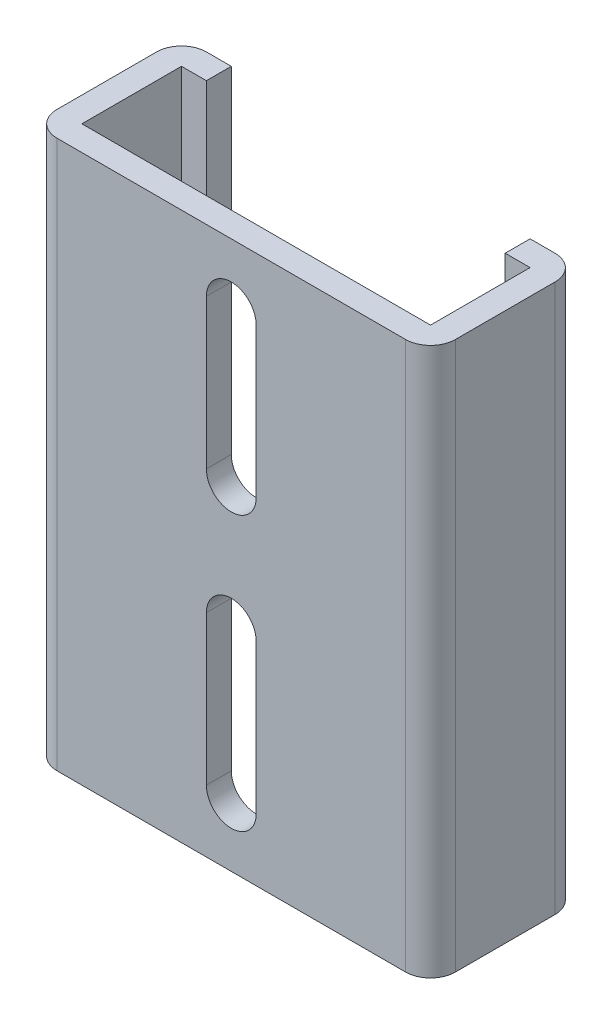
ISO-10303-21;
HEADER;
FILE_DESCRIPTION(('STEP AP214'),'2;1');
FILE_NAME('part.step','',(''),(''),'','','');
FILE_SCHEMA(('AUTOMOTIVE_DESIGN { 1 0 10303 214 1 1 1 1 }'));
ENDSEC;
DATA;
#1=APPLICATION_CONTEXT('core data for automotive mechanical design processes');
#2=APPLICATION_PROTOCOL_DEFINITION('international standard','automotive_design',2000,#1);
#3=PRODUCT_CONTEXT('',#1,'mechanical');
#4=PRODUCT('Part','Part','',(#3));
#5=PRODUCT_RELATED_PRODUCT_CATEGORY('part','',(#4));
#6=PRODUCT_DEFINITION_FORMATION('','',#4);
#7=PRODUCT_DEFINITION_CONTEXT('part definition',#1,'design');
#8=PRODUCT_DEFINITION('design','',#6,#7);
#9=PRODUCT_DEFINITION_SHAPE('','',#8);
#10=(LENGTH_UNIT() NAMED_UNIT(*) SI_UNIT(.MILLI.,.METRE.));
#11=(NAMED_UNIT(*) PLANE_ANGLE_UNIT() SI_UNIT($,.RADIAN.));
#12=(NAMED_UNIT(*) SI_UNIT($,.STERADIAN.) SOLID_ANGLE_UNIT());
#13=UNCERTAINTY_MEASURE_WITH_UNIT(LENGTH_MEASURE(1.E-05),#10,'distance_accuracy_value','');
#14=(GEOMETRIC_REPRESENTATION_CONTEXT(3) GLOBAL_UNCERTAINTY_ASSIGNED_CONTEXT((#13)) GLOBAL_UNIT_ASSIGNED_CONTEXT((#10,
#11,#12)) REPRESENTATION_CONTEXT('',''));
#15=CARTESIAN_POINT('',(0.,0.,0.));
#16=DIRECTION('',(0.,0.,1.));
#17=DIRECTION('',(1.,0.,0.));
#18=AXIS2_PLACEMENT_3D('',#15,#16,#17);
#19=CARTESIAN_POINT('',(-3.5,11.,-2.5));
#20=DIRECTION('',(0.,0.,-1.));
#21=DIRECTION('',(-1.,0.,0.));
#22=AXIS2_PLACEMENT_3D('',#19,#20,#21);
#23=PLANE('',#22);
#24=DIRECTION('',(1.,0.,0.));
#25=VECTOR('',#24,1.);
#26=CARTESIAN_POINT('',(-3.5,0.,-2.5));
#27=LINE('',#26,#25);
#28=CARTESIAN_POINT('',(-3.5,0.,-2.5));
#29=VERTEX_POINT('',#28);
#30=CARTESIAN_POINT('',(-3.,0.,-2.5));
#31=VERTEX_POINT('',#30);
#32=EDGE_CURVE('E257',#29,#31,#27,.T.);
#33=ORIENTED_EDGE('',*,*,#32,.T.);
#34=DIRECTION('',(0.,-1.,0.));
#35=VECTOR('',#34,1.);
#36=CARTESIAN_POINT('',(-3.,11.,-2.5));
#37=LINE('',#36,#35);
#38=CARTESIAN_POINT('',(-3.,11.,-2.5));
#39=VERTEX_POINT('',#38);
#40=EDGE_CURVE('E403',#39,#31,#37,.T.);
#41=ORIENTED_EDGE('',*,*,#40,.F.);
#42=DIRECTION('',(1.,0.,0.));
#43=VECTOR('',#42,1.);
#44=CARTESIAN_POINT('',(-3.5,11.,-2.5));
#45=LINE('',#44,#43);
#46=CARTESIAN_POINT('',(-3.5,11.,-2.5));
#47=VERTEX_POINT('',#46);
#48=EDGE_CURVE('E266',#47,#39,#45,.T.);
#49=ORIENTED_EDGE('',*,*,#48,.F.);
#50=DIRECTION('',(0.,-1.,0.));
#51=VECTOR('',#50,1.);
#52=CARTESIAN_POINT('',(-3.5,11.,-2.5));
#53=LINE('',#52,#51);
#54=EDGE_CURVE('E319',#47,#29,#53,.T.);
#55=ORIENTED_EDGE('',*,*,#54,.T.);
#56=EDGE_LOOP('',(#33,#41,#49,#55));
#57=FACE_BOUND('',#56,.T.);
#58=ADVANCED_FACE('F41',(#57),#23,.F.);
#59=CARTESIAN_POINT('',(-3.,11.,-3.));
#60=DIRECTION('',(1.,0.,0.));
#61=DIRECTION('',(0.,0.,-1.));
#62=AXIS2_PLACEMENT_3D('',#59,#60,#61);
#63=PLANE('',#62);
#64=DIRECTION('',(0.,0.,1.));
#65=VECTOR('',#64,1.);
#66=CARTESIAN_POINT('',(-3.,0.,-3.));
#67=LINE('',#66,#65);
#68=CARTESIAN_POINT('',(-3.,0.,-3.));
#69=VERTEX_POINT('',#68);
#70=EDGE_CURVE('E322',#69,#31,#67,.T.);
#71=ORIENTED_EDGE('',*,*,#70,.F.);
#72=DIRECTION('',(0.,-1.,0.));
#73=VECTOR('',#72,1.);
#74=CARTESIAN_POINT('',(-3.,11.,-3.));
#75=LINE('',#74,#73);
#76=CARTESIAN_POINT('',(-3.,11.,-3.));
#77=VERTEX_POINT('',#76);
#78=EDGE_CURVE('E401',#77,#69,#75,.T.);
#79=ORIENTED_EDGE('',*,*,#78,.F.);
#80=DIRECTION('',(0.,0.,1.));
#81=VECTOR('',#80,1.);
#82=CARTESIAN_POINT('',(-3.,11.,-3.));
#83=LINE('',#82,#81);
#84=EDGE_CURVE('E268',#77,#39,#83,.T.);
#85=ORIENTED_EDGE('',*,*,#84,.T.);
#86=ORIENTED_EDGE('',*,*,#40,.T.);
#87=EDGE_LOOP('',(#71,#79,#85,#86));
#88=FACE_BOUND('',#87,.T.);
#89=ADVANCED_FACE('F444',(#88),#63,.T.);
#90=CARTESIAN_POINT('',(-3.5,11.,-3.));
#91=DIRECTION('',(0.,0.,-1.));
#92=DIRECTION('',(-1.,0.,0.));
#93=AXIS2_PLACEMENT_3D('',#90,#91,#92);
#94=PLANE('',#93);
#95=DIRECTION('',(1.,0.,0.));
#96=VECTOR('',#95,1.);
#97=CARTESIAN_POINT('',(-3.5,0.,-3.));
#98=LINE('',#97,#96);
#99=CARTESIAN_POINT('',(-3.5,0.,-3.));
#100=VERTEX_POINT('',#99);
#101=EDGE_CURVE('E325',#100,#69,#98,.T.);
#102=ORIENTED_EDGE('',*,*,#101,.F.);
#103=DIRECTION('',(0.,-1.,0.));
#104=VECTOR('',#103,1.);
#105=CARTESIAN_POINT('',(-3.5,11.,-3.));
#106=LINE('',#105,#104);
#107=CARTESIAN_POINT('',(-3.5,11.,-3.));
#108=VERTEX_POINT('',#107);
#109=EDGE_CURVE('E399',#108,#100,#106,.T.);
#110=ORIENTED_EDGE('',*,*,#109,.F.);
#111=DIRECTION('',(1.,0.,0.));
#112=VECTOR('',#111,1.);
#113=CARTESIAN_POINT('',(-3.5,11.,-3.));
#114=LINE('',#113,#112);
#115=EDGE_CURVE('E272',#108,#77,#114,.T.);
#116=ORIENTED_EDGE('',*,*,#115,.T.);
#117=ORIENTED_EDGE('',*,*,#78,.T.);
#118=EDGE_LOOP('',(#102,#110,#116,#117));
#119=FACE_BOUND('',#118,.T.);
#120=ADVANCED_FACE('F449',(#119),#94,.T.);
#121=CARTESIAN_POINT('',(-3.5,11.,-2.5));
#122=DIRECTION('',(0.,-1.,0.));
#123=DIRECTION('',(0.,0.,-1.));
#124=AXIS2_PLACEMENT_3D('',#121,#122,#123);
#125=CYLINDRICAL_SURFACE('',#124,0.5);
#126=CARTESIAN_POINT('',(-3.5,0.,-2.5));
#127=DIRECTION('',(0.,-1.,0.));
#128=DIRECTION('',(0.,0.,-1.));
#129=AXIS2_PLACEMENT_3D('',#126,#127,#128);
#130=CIRCLE('',#129,0.5);
#131=CARTESIAN_POINT('',(-4.,0.,-2.5));
#132=VERTEX_POINT('',#131);
#133=EDGE_CURVE('E328',#132,#100,#130,.T.);
#134=ORIENTED_EDGE('',*,*,#133,.F.);
#135=DIRECTION('',(0.,-1.,0.));
#136=VECTOR('',#135,1.);
#137=CARTESIAN_POINT('',(-4.,11.,-2.5));
#138=LINE('',#137,#136);
#139=CARTESIAN_POINT('',(-4.,11.,-2.5));
#140=VERTEX_POINT('',#139);
#141=EDGE_CURVE('E397',#140,#132,#138,.T.);
#142=ORIENTED_EDGE('',*,*,#141,.F.);
#143=CARTESIAN_POINT('',(-3.5,11.,-2.5));
#144=DIRECTION('',(0.,-1.,0.));
#145=DIRECTION('',(0.,0.,-1.));
#146=AXIS2_PLACEMENT_3D('',#143,#144,#145);
#147=CIRCLE('',#146,0.5);
#148=EDGE_CURVE('E275',#140,#108,#147,.T.);
#149=ORIENTED_EDGE('',*,*,#148,.T.);
#150=ORIENTED_EDGE('',*,*,#109,.T.);
#151=EDGE_LOOP('',(#134,#142,#149,#150));
#152=FACE_BOUND('',#151,.T.);
#153=ADVANCED_FACE('F468',(#152),#125,.T.);
#154=CARTESIAN_POINT('',(-4.,11.,-0.5));
#155=DIRECTION('',(-1.,0.,0.));
#156=DIRECTION('',(0.,0.,1.));
#157=AXIS2_PLACEMENT_3D('',#154,#155,#156);
#158=PLANE('',#157);
#159=DIRECTION('',(0.,0.,-1.));
#160=VECTOR('',#159,1.);
#161=CARTESIAN_POINT('',(-4.,0.,-0.5));
#162=LINE('',#161,#160);
#163=CARTESIAN_POINT('',(-4.,0.,-0.5));
#164=VERTEX_POINT('',#163);
#165=EDGE_CURVE('E331',#164,#132,#162,.T.);
#166=ORIENTED_EDGE('',*,*,#165,.F.);
#167=DIRECTION('',(0.,-1.,0.));
#168=VECTOR('',#167,1.);
#169=CARTESIAN_POINT('',(-4.,11.,-0.5));
#170=LINE('',#169,#168);
#171=CARTESIAN_POINT('',(-4.,11.,-0.5));
#172=VERTEX_POINT('',#171);
#173=EDGE_CURVE('E395',#172,#164,#170,.T.);
#174=ORIENTED_EDGE('',*,*,#173,.F.);
#175=DIRECTION('',(0.,0.,-1.));
#176=VECTOR('',#175,1.);
#177=CARTESIAN_POINT('',(-4.,11.,-0.5));
#178=LINE('',#177,#176);
#179=EDGE_CURVE('E278',#172,#140,#178,.T.);
#180=ORIENTED_EDGE('',*,*,#179,.T.);
#181=ORIENTED_EDGE('',*,*,#141,.T.);
#182=EDGE_LOOP('',(#166,#174,#180,#181));
#183=FACE_BOUND('',#182,.T.);
#184=ADVANCED_FACE('F473',(#183),#158,.T.);
#185=CARTESIAN_POINT('',(-3.5,11.,-0.5));
#186=DIRECTION('',(0.,-1.,0.));
#187=DIRECTION('',(0.,0.,-1.));
#188=AXIS2_PLACEMENT_3D('',#185,#186,#187);
#189=CYLINDRICAL_SURFACE('',#188,0.5);
#190=CARTESIAN_POINT('',(-3.5,0.,-0.5));
#191=DIRECTION('',(0.,-1.,0.));
#192=DIRECTION('',(0.,0.,-1.));
#193=AXIS2_PLACEMENT_3D('',#190,#191,#192);
#194=CIRCLE('',#193,0.5);
#195=CARTESIAN_POINT('',(-3.5,0.,0.));
#196=VERTEX_POINT('',#195);
#197=EDGE_CURVE('E334',#196,#164,#194,.T.);
#198=ORIENTED_EDGE('',*,*,#197,.F.);
#199=DIRECTION('',(0.,-1.,0.));
#200=VECTOR('',#199,1.);
#201=CARTESIAN_POINT('',(-3.5,11.,0.));
#202=LINE('',#201,#200);
#203=CARTESIAN_POINT('',(-3.5,11.,0.));
#204=VERTEX_POINT('',#203);
#205=EDGE_CURVE('E393',#204,#196,#202,.T.);
#206=ORIENTED_EDGE('',*,*,#205,.F.);
#207=CARTESIAN_POINT('',(-3.5,11.,-0.5));
#208=DIRECTION('',(0.,-1.,0.));
#209=DIRECTION('',(0.,0.,-1.));
#210=AXIS2_PLACEMENT_3D('',#207,#208,#209);
#211=CIRCLE('',#210,0.5);
#212=EDGE_CURVE('E281',#204,#172,#211,.T.);
#213=ORIENTED_EDGE('',*,*,#212,.T.);
#214=ORIENTED_EDGE('',*,*,#173,.T.);
#215=EDGE_LOOP('',(#198,#206,#213,#214));
#216=FACE_BOUND('',#215,.T.);
#217=ADVANCED_FACE('F476',(#216),#189,.T.);
#218=CARTESIAN_POINT('',(-3.5,11.,0.));
#219=DIRECTION('',(0.,0.,1.));
#220=DIRECTION('',(1.,0.,0.));
#221=AXIS2_PLACEMENT_3D('',#218,#219,#220);
#222=PLANE('',#221);
#223=CARTESIAN_POINT('',(0.,4.25,0.));
#224=DIRECTION('',(0.,0.,1.));
#225=DIRECTION('',(1.,0.,0.));
#226=AXIS2_PLACEMENT_3D('',#223,#224,#225);
#227=CIRCLE('',#226,0.5);
#228=CARTESIAN_POINT('',(0.499999999999999,4.25,0.));
#229=VERTEX_POINT('',#228);
#230=CARTESIAN_POINT('',(-0.5,4.25,0.));
#231=VERTEX_POINT('',#230);
#232=EDGE_CURVE('E55',#229,#231,#227,.T.);
#233=ORIENTED_EDGE('',*,*,#232,.F.);
#234=DIRECTION('',(0.,1.,0.));
#235=VECTOR('',#234,1.);
#236=CARTESIAN_POINT('',(0.499999999999999,4.25,0.));
#237=LINE('',#236,#235);
#238=CARTESIAN_POINT('',(0.5,1.25,0.));
#239=VERTEX_POINT('',#238);
#240=EDGE_CURVE('E231',#239,#229,#237,.T.);
#241=ORIENTED_EDGE('',*,*,#240,.F.);
#242=CARTESIAN_POINT('',(0.,1.25,0.));
#243=DIRECTION('',(0.,0.,1.));
#244=DIRECTION('',(1.,0.,0.));
#245=AXIS2_PLACEMENT_3D('',#242,#243,#244);
#246=CIRCLE('',#245,0.5);
#247=CARTESIAN_POINT('',(-0.499999999999999,1.25,0.));
#248=VERTEX_POINT('',#247);
#249=EDGE_CURVE('E215',#248,#239,#246,.T.);
#250=ORIENTED_EDGE('',*,*,#249,.F.);
#251=DIRECTION('',(0.,-1.,0.));
#252=VECTOR('',#251,1.);
#253=CARTESIAN_POINT('',(-0.5,4.25,0.));
#254=LINE('',#253,#252);
#255=EDGE_CURVE('E224',#231,#248,#254,.T.);
#256=ORIENTED_EDGE('',*,*,#255,.F.);
#257=EDGE_LOOP('',(#233,#241,#250,#256));
#258=FACE_BOUND('',#257,.T.);
#259=CARTESIAN_POINT('',(0.,6.75,0.));
#260=DIRECTION('',(0.,0.,1.));
#261=DIRECTION('',(1.,0.,0.));
#262=AXIS2_PLACEMENT_3D('',#259,#260,#261);
#263=CIRCLE('',#262,0.5);
#264=CARTESIAN_POINT('',(-0.5,6.75,0.));
#265=VERTEX_POINT('',#264);
#266=CARTESIAN_POINT('',(0.499999999999999,6.75,0.));
#267=VERTEX_POINT('',#266);
#268=EDGE_CURVE('E238',#265,#267,#263,.T.);
#269=ORIENTED_EDGE('',*,*,#268,.F.);
#270=DIRECTION('',(0.,-1.,0.));
#271=VECTOR('',#270,1.);
#272=CARTESIAN_POINT('',(-0.5,6.75,0.));
#273=LINE('',#272,#271);
#274=CARTESIAN_POINT('',(-0.5,9.75,0.));
#275=VERTEX_POINT('',#274);
#276=EDGE_CURVE('E250',#275,#265,#273,.T.);
#277=ORIENTED_EDGE('',*,*,#276,.F.);
#278=CARTESIAN_POINT('',(0.,9.75,0.));
#279=DIRECTION('',(0.,0.,1.));
#280=DIRECTION('',(1.,0.,0.));
#281=AXIS2_PLACEMENT_3D('',#278,#279,#280);
#282=CIRCLE('',#281,0.5);
#283=CARTESIAN_POINT('',(0.499999999999999,9.75,0.));
#284=VERTEX_POINT('',#283);
#285=EDGE_CURVE('E246',#284,#275,#282,.T.);
#286=ORIENTED_EDGE('',*,*,#285,.F.);
#287=DIRECTION('',(0.,1.,0.));
#288=VECTOR('',#287,1.);
#289=CARTESIAN_POINT('',(0.5,6.75,0.));
#290=LINE('',#289,#288);
#291=EDGE_CURVE('E242',#267,#284,#290,.T.);
#292=ORIENTED_EDGE('',*,*,#291,.F.);
#293=EDGE_LOOP('',(#269,#277,#286,#292));
#294=FACE_BOUND('',#293,.T.);
#295=DIRECTION('',(-1.,0.,0.));
#296=VECTOR('',#295,1.);
#297=CARTESIAN_POINT('',(-3.5,0.,0.));
#298=LINE('',#297,#296);
#299=CARTESIAN_POINT('',(3.5,0.,0.));
#300=VERTEX_POINT('',#299);
#301=EDGE_CURVE('E337',#300,#196,#298,.T.);
#302=ORIENTED_EDGE('',*,*,#301,.F.);
#303=DIRECTION('',(0.,-1.,0.));
#304=VECTOR('',#303,1.);
#305=CARTESIAN_POINT('',(3.5,11.,0.));
#306=LINE('',#305,#304);
#307=CARTESIAN_POINT('',(3.5,11.,0.));
#308=VERTEX_POINT('',#307);
#309=EDGE_CURVE('E390',#308,#300,#306,.T.);
#310=ORIENTED_EDGE('',*,*,#309,.F.);
#311=DIRECTION('',(-1.,0.,0.));
#312=VECTOR('',#311,1.);
#313=CARTESIAN_POINT('',(-3.5,11.,0.));
#314=LINE('',#313,#312);
#315=EDGE_CURVE('E284',#308,#204,#314,.T.);
#316=ORIENTED_EDGE('',*,*,#315,.T.);
#317=ORIENTED_EDGE('',*,*,#205,.T.);
#318=EDGE_LOOP('',(#302,#310,#316,#317));
#319=FACE_BOUND('',#318,.T.);
#320=ADVANCED_FACE('F228',(#258,#294,#319),#222,.T.);
#321=CARTESIAN_POINT('',(3.5,11.,-0.5));
#322=DIRECTION('',(0.,-1.,0.));
#323=DIRECTION('',(0.,0.,-1.));
#324=AXIS2_PLACEMENT_3D('',#321,#322,#323);
#325=CYLINDRICAL_SURFACE('',#324,0.5);
#326=CARTESIAN_POINT('',(3.5,0.,-0.5));
#327=DIRECTION('',(0.,-1.,0.));
#328=DIRECTION('',(0.,0.,1.));
#329=AXIS2_PLACEMENT_3D('',#326,#327,#328);
#330=CIRCLE('',#329,0.5);
#331=CARTESIAN_POINT('',(4.,0.,-0.5));
#332=VERTEX_POINT('',#331);
#333=EDGE_CURVE('E340',#332,#300,#330,.T.);
#334=ORIENTED_EDGE('',*,*,#333,.F.);
#335=DIRECTION('',(0.,-1.,0.));
#336=VECTOR('',#335,1.);
#337=CARTESIAN_POINT('',(4.,11.,-0.5));
#338=LINE('',#337,#336);
#339=CARTESIAN_POINT('',(4.,11.,-0.5));
#340=VERTEX_POINT('',#339);
#341=EDGE_CURVE('E387',#340,#332,#338,.T.);
#342=ORIENTED_EDGE('',*,*,#341,.F.);
#343=CARTESIAN_POINT('',(3.5,11.,-0.5));
#344=DIRECTION('',(0.,-1.,0.));
#345=DIRECTION('',(0.,0.,1.));
#346=AXIS2_PLACEMENT_3D('',#343,#344,#345);
#347=CIRCLE('',#346,0.5);
#348=EDGE_CURVE('E288',#340,#308,#347,.T.);
#349=ORIENTED_EDGE('',*,*,#348,.T.);
#350=ORIENTED_EDGE('',*,*,#309,.T.);
#351=EDGE_LOOP('',(#334,#342,#349,#350));
#352=FACE_BOUND('',#351,.T.);
#353=ADVANCED_FACE('F483',(#352),#325,.T.);
#354=CARTESIAN_POINT('',(4.,11.,-0.5));
#355=DIRECTION('',(1.,0.,0.));
#356=DIRECTION('',(0.,0.,-1.));
#357=AXIS2_PLACEMENT_3D('',#354,#355,#356);
#358=PLANE('',#357);
#359=DIRECTION('',(0.,0.,1.));
#360=VECTOR('',#359,1.);
#361=CARTESIAN_POINT('',(4.,0.,-0.5));
#362=LINE('',#361,#360);
#363=CARTESIAN_POINT('',(4.,0.,-2.5));
#364=VERTEX_POINT('',#363);
#365=EDGE_CURVE('E343',#364,#332,#362,.T.);
#366=ORIENTED_EDGE('',*,*,#365,.F.);
#367=DIRECTION('',(0.,-1.,0.));
#368=VECTOR('',#367,1.);
#369=CARTESIAN_POINT('',(4.,11.,-2.5));
#370=LINE('',#369,#368);
#371=CARTESIAN_POINT('',(4.,11.,-2.5));
#372=VERTEX_POINT('',#371);
#373=EDGE_CURVE('E384',#372,#364,#370,.T.);
#374=ORIENTED_EDGE('',*,*,#373,.F.);
#375=DIRECTION('',(0.,0.,1.));
#376=VECTOR('',#375,1.);
#377=CARTESIAN_POINT('',(4.,11.,-0.5));
#378=LINE('',#377,#376);
#379=EDGE_CURVE('E292',#372,#340,#378,.T.);
#380=ORIENTED_EDGE('',*,*,#379,.T.);
#381=ORIENTED_EDGE('',*,*,#341,.T.);
#382=EDGE_LOOP('',(#366,#374,#380,#381));
#383=FACE_BOUND('',#382,.T.);
#384=ADVANCED_FACE('F488',(#383),#358,.T.);
#385=CARTESIAN_POINT('',(3.5,11.,-2.5));
#386=DIRECTION('',(0.,-1.,0.));
#387=DIRECTION('',(0.,0.,-1.));
#388=AXIS2_PLACEMENT_3D('',#385,#386,#387);
#389=CYLINDRICAL_SURFACE('',#388,0.5);
#390=CARTESIAN_POINT('',(3.5,0.,-2.5));
#391=DIRECTION('',(0.,-1.,0.));
#392=DIRECTION('',(0.,0.,1.));
#393=AXIS2_PLACEMENT_3D('',#390,#391,#392);
#394=CIRCLE('',#393,0.5);
#395=CARTESIAN_POINT('',(3.5,0.,-3.));
#396=VERTEX_POINT('',#395);
#397=EDGE_CURVE('E346',#396,#364,#394,.T.);
#398=ORIENTED_EDGE('',*,*,#397,.F.);
#399=DIRECTION('',(0.,-1.,0.));
#400=VECTOR('',#399,1.);
#401=CARTESIAN_POINT('',(3.5,11.,-3.));
#402=LINE('',#401,#400);
#403=CARTESIAN_POINT('',(3.5,11.,-3.));
#404=VERTEX_POINT('',#403);
#405=EDGE_CURVE('E381',#404,#396,#402,.T.);
#406=ORIENTED_EDGE('',*,*,#405,.F.);
#407=CARTESIAN_POINT('',(3.5,11.,-2.5));
#408=DIRECTION('',(0.,-1.,0.));
#409=DIRECTION('',(0.,0.,1.));
#410=AXIS2_PLACEMENT_3D('',#407,#408,#409);
#411=CIRCLE('',#410,0.5);
#412=EDGE_CURVE('E296',#404,#372,#411,.T.);
#413=ORIENTED_EDGE('',*,*,#412,.T.);
#414=ORIENTED_EDGE('',*,*,#373,.T.);
#415=EDGE_LOOP('',(#398,#406,#413,#414));
#416=FACE_BOUND('',#415,.T.);
#417=ADVANCED_FACE('F491',(#416),#389,.T.);
#418=CARTESIAN_POINT('',(3.5,11.,-3.));
#419=DIRECTION('',(0.,0.,-1.));
#420=DIRECTION('',(-1.,0.,0.));
#421=AXIS2_PLACEMENT_3D('',#418,#419,#420);
#422=PLANE('',#421);
#423=DIRECTION('',(1.,0.,0.));
#424=VECTOR('',#423,1.);
#425=CARTESIAN_POINT('',(3.5,0.,-3.));
#426=LINE('',#425,#424);
#427=CARTESIAN_POINT('',(3.,0.,-3.));
#428=VERTEX_POINT('',#427);
#429=EDGE_CURVE('E349',#428,#396,#426,.T.);
#430=ORIENTED_EDGE('',*,*,#429,.F.);
#431=DIRECTION('',(0.,-1.,0.));
#432=VECTOR('',#431,1.);
#433=CARTESIAN_POINT('',(3.,11.,-3.));
#434=LINE('',#433,#432);
#435=CARTESIAN_POINT('',(3.,11.,-3.));
#436=VERTEX_POINT('',#435);
#437=EDGE_CURVE('E378',#436,#428,#434,.T.);
#438=ORIENTED_EDGE('',*,*,#437,.F.);
#439=DIRECTION('',(1.,0.,0.));
#440=VECTOR('',#439,1.);
#441=CARTESIAN_POINT('',(3.5,11.,-3.));
#442=LINE('',#441,#440);
#443=EDGE_CURVE('E300',#436,#404,#442,.T.);
#444=ORIENTED_EDGE('',*,*,#443,.T.);
#445=ORIENTED_EDGE('',*,*,#405,.T.);
#446=EDGE_LOOP('',(#430,#438,#444,#445));
#447=FACE_BOUND('',#446,.T.);
#448=ADVANCED_FACE('F496',(#447),#422,.T.);
#449=CARTESIAN_POINT('',(3.,11.,-2.5));
#450=DIRECTION('',(-1.,0.,0.));
#451=DIRECTION('',(0.,0.,1.));
#452=AXIS2_PLACEMENT_3D('',#449,#450,#451);
#453=PLANE('',#452);
#454=DIRECTION('',(0.,0.,-1.));
#455=VECTOR('',#454,1.);
#456=CARTESIAN_POINT('',(3.,0.,-2.5));
#457=LINE('',#456,#455);
#458=CARTESIAN_POINT('',(3.,0.,-2.5));
#459=VERTEX_POINT('',#458);
#460=EDGE_CURVE('E352',#459,#428,#457,.T.);
#461=ORIENTED_EDGE('',*,*,#460,.F.);
#462=DIRECTION('',(0.,-1.,0.));
#463=VECTOR('',#462,1.);
#464=CARTESIAN_POINT('',(3.,11.,-2.5));
#465=LINE('',#464,#463);
#466=CARTESIAN_POINT('',(3.,11.,-2.5));
#467=VERTEX_POINT('',#466);
#468=EDGE_CURVE('E375',#467,#459,#465,.T.);
#469=ORIENTED_EDGE('',*,*,#468,.F.);
#470=DIRECTION('',(0.,0.,-1.));
#471=VECTOR('',#470,1.);
#472=CARTESIAN_POINT('',(3.,11.,-2.5));
#473=LINE('',#472,#471);
#474=EDGE_CURVE('E304',#467,#436,#473,.T.);
#475=ORIENTED_EDGE('',*,*,#474,.T.);
#476=ORIENTED_EDGE('',*,*,#437,.T.);
#477=EDGE_LOOP('',(#461,#469,#475,#476));
#478=FACE_BOUND('',#477,.T.);
#479=ADVANCED_FACE('F499',(#478),#453,.T.);
#480=CARTESIAN_POINT('',(3.5,11.,-2.5));
#481=DIRECTION('',(0.,0.,-1.));
#482=DIRECTION('',(-1.,0.,0.));
#483=AXIS2_PLACEMENT_3D('',#480,#481,#482);
#484=PLANE('',#483);
#485=DIRECTION('',(1.,0.,0.));
#486=VECTOR('',#485,1.);
#487=CARTESIAN_POINT('',(3.5,0.,-2.5));
#488=LINE('',#487,#486);
#489=CARTESIAN_POINT('',(3.5,0.,-2.5));
#490=VERTEX_POINT('',#489);
#491=EDGE_CURVE('E355',#459,#490,#488,.T.);
#492=ORIENTED_EDGE('',*,*,#491,.T.);
#493=DIRECTION('',(0.,-1.,0.));
#494=VECTOR('',#493,1.);
#495=CARTESIAN_POINT('',(3.5,11.,-2.5));
#496=LINE('',#495,#494);
#497=CARTESIAN_POINT('',(3.5,11.,-2.5));
#498=VERTEX_POINT('',#497);
#499=EDGE_CURVE('E371',#498,#490,#496,.T.);
#500=ORIENTED_EDGE('',*,*,#499,.F.);
#501=DIRECTION('',(1.,0.,0.));
#502=VECTOR('',#501,1.);
#503=CARTESIAN_POINT('',(3.5,11.,-2.5));
#504=LINE('',#503,#502);
#505=EDGE_CURVE('E308',#467,#498,#504,.T.);
#506=ORIENTED_EDGE('',*,*,#505,.F.);
#507=ORIENTED_EDGE('',*,*,#468,.T.);
#508=EDGE_LOOP('',(#492,#500,#506,#507));
#509=FACE_BOUND('',#508,.T.);
#510=ADVANCED_FACE('F505',(#509),#484,.F.);
#511=CARTESIAN_POINT('',(3.5,11.,-0.5));
#512=DIRECTION('',(1.,0.,0.));
#513=DIRECTION('',(0.,0.,-1.));
#514=AXIS2_PLACEMENT_3D('',#511,#512,#513);
#515=PLANE('',#514);
#516=DIRECTION('',(0.,0.,-1.));
#517=VECTOR('',#516,1.);
#518=CARTESIAN_POINT('',(3.5,0.,-0.5));
#519=LINE('',#518,#517);
#520=CARTESIAN_POINT('',(3.5,0.,-0.5));
#521=VERTEX_POINT('',#520);
#522=EDGE_CURVE('E357',#490,#521,#519,.F.);
#523=ORIENTED_EDGE('',*,*,#522,.T.);
#524=DIRECTION('',(0.,-1.,0.));
#525=VECTOR('',#524,1.);
#526=CARTESIAN_POINT('',(3.5,11.,-0.5));
#527=LINE('',#526,#525);
#528=CARTESIAN_POINT('',(3.5,11.,-0.5));
#529=VERTEX_POINT('',#528);
#530=EDGE_CURVE('E367',#529,#521,#527,.T.);
#531=ORIENTED_EDGE('',*,*,#530,.F.);
#532=DIRECTION('',(0.,0.,-1.));
#533=VECTOR('',#532,1.);
#534=CARTESIAN_POINT('',(3.5,11.,-0.5));
#535=LINE('',#534,#533);
#536=EDGE_CURVE('E311',#498,#529,#535,.F.);
#537=ORIENTED_EDGE('',*,*,#536,.F.);
#538=ORIENTED_EDGE('',*,*,#499,.T.);
#539=EDGE_LOOP('',(#523,#531,#537,#538));
#540=FACE_BOUND('',#539,.T.);
#541=ADVANCED_FACE('F509',(#540),#515,.F.);
#542=CARTESIAN_POINT('',(-3.5,11.,-0.5));
#543=DIRECTION('',(0.,0.,1.));
#544=DIRECTION('',(1.,0.,0.));
#545=AXIS2_PLACEMENT_3D('',#542,#543,#544);
#546=PLANE('',#545);
#547=DIRECTION('',(0.,1.,0.));
#548=VECTOR('',#547,1.);
#549=CARTESIAN_POINT('',(0.499999999999997,11.,-0.5));
#550=LINE('',#549,#548);
#551=CARTESIAN_POINT('',(0.5,1.25,-0.5));
#552=VERTEX_POINT('',#551);
#553=CARTESIAN_POINT('',(0.499999999999999,4.25,-0.5));
#554=VERTEX_POINT('',#553);
#555=EDGE_CURVE('E48',#552,#554,#550,.T.);
#556=ORIENTED_EDGE('',*,*,#555,.T.);
#557=CARTESIAN_POINT('',(0.,4.25,-0.5));
#558=DIRECTION('',(0.,0.,1.));
#559=DIRECTION('',(1.,0.,0.));
#560=AXIS2_PLACEMENT_3D('',#557,#558,#559);
#561=CIRCLE('',#560,0.5);
#562=CARTESIAN_POINT('',(-0.5,4.25,-0.5));
#563=VERTEX_POINT('',#562);
#564=EDGE_CURVE('E11',#554,#563,#561,.T.);
#565=ORIENTED_EDGE('',*,*,#564,.T.);
#566=DIRECTION('',(0.,-1.,0.));
#567=VECTOR('',#566,1.);
#568=CARTESIAN_POINT('',(-0.500000000000002,11.,-0.5));
#569=LINE('',#568,#567);
#570=CARTESIAN_POINT('',(-0.499999999999999,1.25,-0.5));
#571=VERTEX_POINT('',#570);
#572=EDGE_CURVE('E420',#563,#571,#569,.T.);
#573=ORIENTED_EDGE('',*,*,#572,.T.);
#574=CARTESIAN_POINT('',(0.,1.25,-0.5));
#575=DIRECTION('',(0.,0.,1.));
#576=DIRECTION('',(1.,0.,0.));
#577=AXIS2_PLACEMENT_3D('',#574,#575,#576);
#578=CIRCLE('',#577,0.5);
#579=EDGE_CURVE('E218',#571,#552,#578,.T.);
#580=ORIENTED_EDGE('',*,*,#579,.T.);
#581=EDGE_LOOP('',(#556,#565,#573,#580));
#582=FACE_BOUND('',#581,.T.);
#583=DIRECTION('',(0.,-1.,0.));
#584=VECTOR('',#583,1.);
#585=CARTESIAN_POINT('',(-0.5,11.,-0.5));
#586=LINE('',#585,#584);
#587=CARTESIAN_POINT('',(-0.5,9.75,-0.5));
#588=VERTEX_POINT('',#587);
#589=CARTESIAN_POINT('',(-0.5,6.75,-0.5));
#590=VERTEX_POINT('',#589);
#591=EDGE_CURVE('E413',#588,#590,#586,.T.);
#592=ORIENTED_EDGE('',*,*,#591,.T.);
#593=CARTESIAN_POINT('',(0.,6.75,-0.5));
#594=DIRECTION('',(0.,0.,1.));
#595=DIRECTION('',(1.,0.,0.));
#596=AXIS2_PLACEMENT_3D('',#593,#594,#595);
#597=CIRCLE('',#596,0.5);
#598=CARTESIAN_POINT('',(0.5,6.75,-0.5));
#599=VERTEX_POINT('',#598);
#600=EDGE_CURVE('E417',#590,#599,#597,.T.);
#601=ORIENTED_EDGE('',*,*,#600,.T.);
#602=DIRECTION('',(0.,1.,0.));
#603=VECTOR('',#602,1.);
#604=CARTESIAN_POINT('',(0.499999999999999,11.,-0.5));
#605=LINE('',#604,#603);
#606=CARTESIAN_POINT('',(0.499999999999999,9.75,-0.5));
#607=VERTEX_POINT('',#606);
#608=EDGE_CURVE('E405',#599,#607,#605,.T.);
#609=ORIENTED_EDGE('',*,*,#608,.T.);
#610=CARTESIAN_POINT('',(0.,9.75,-0.5));
#611=DIRECTION('',(0.,0.,1.));
#612=DIRECTION('',(1.,0.,0.));
#613=AXIS2_PLACEMENT_3D('',#610,#611,#612);
#614=CIRCLE('',#613,0.5);
#615=EDGE_CURVE('E409',#607,#588,#614,.T.);
#616=ORIENTED_EDGE('',*,*,#615,.T.);
#617=EDGE_LOOP('',(#592,#601,#609,#616));
#618=FACE_BOUND('',#617,.T.);
#619=DIRECTION('',(1.,0.,0.));
#620=VECTOR('',#619,1.);
#621=CARTESIAN_POINT('',(-3.5,0.,-0.5));
#622=LINE('',#621,#620);
#623=CARTESIAN_POINT('',(-3.5,0.,-0.5));
#624=VERTEX_POINT('',#623);
#625=EDGE_CURVE('E359',#521,#624,#622,.F.);
#626=ORIENTED_EDGE('',*,*,#625,.T.);
#627=DIRECTION('',(0.,-1.,0.));
#628=VECTOR('',#627,1.);
#629=CARTESIAN_POINT('',(-3.5,11.,-0.5));
#630=LINE('',#629,#628);
#631=CARTESIAN_POINT('',(-3.5,11.,-0.5));
#632=VERTEX_POINT('',#631);
#633=EDGE_CURVE('E364',#632,#624,#630,.T.);
#634=ORIENTED_EDGE('',*,*,#633,.F.);
#635=DIRECTION('',(1.,0.,0.));
#636=VECTOR('',#635,1.);
#637=CARTESIAN_POINT('',(-3.5,11.,-0.5));
#638=LINE('',#637,#636);
#639=EDGE_CURVE('E314',#529,#632,#638,.F.);
#640=ORIENTED_EDGE('',*,*,#639,.F.);
#641=ORIENTED_EDGE('',*,*,#530,.T.);
#642=EDGE_LOOP('',(#626,#634,#640,#641));
#643=FACE_BOUND('',#642,.T.);
#644=ADVANCED_FACE('F424',(#582,#618,#643),#546,.F.);
#645=CARTESIAN_POINT('',(-3.5,11.,-0.5));
#646=DIRECTION('',(-1.,0.,0.));
#647=DIRECTION('',(0.,0.,1.));
#648=AXIS2_PLACEMENT_3D('',#645,#646,#647);
#649=PLANE('',#648);
#650=DIRECTION('',(0.,0.,-1.));
#651=VECTOR('',#650,1.);
#652=CARTESIAN_POINT('',(-3.5,0.,-0.5));
#653=LINE('',#652,#651);
#654=EDGE_CURVE('E269',#624,#29,#653,.T.);
#655=ORIENTED_EDGE('',*,*,#654,.T.);
#656=ORIENTED_EDGE('',*,*,#54,.F.);
#657=DIRECTION('',(0.,0.,-1.));
#658=VECTOR('',#657,1.);
#659=CARTESIAN_POINT('',(-3.5,11.,-0.5));
#660=LINE('',#659,#658);
#661=EDGE_CURVE('E317',#632,#47,#660,.T.);
#662=ORIENTED_EDGE('',*,*,#661,.F.);
#663=ORIENTED_EDGE('',*,*,#633,.T.);
#664=EDGE_LOOP('',(#655,#656,#662,#663));
#665=FACE_BOUND('',#664,.T.);
#666=ADVANCED_FACE('F516',(#665),#649,.F.);
#667=CARTESIAN_POINT('',(-3.5,11.,-2.5));
#668=DIRECTION('',(0.,-1.,0.));
#669=DIRECTION('',(-1.,0.,0.));
#670=AXIS2_PLACEMENT_3D('',#667,#668,#669);
#671=PLANE('',#670);
#672=ORIENTED_EDGE('',*,*,#48,.T.);
#673=ORIENTED_EDGE('',*,*,#84,.F.);
#674=ORIENTED_EDGE('',*,*,#115,.F.);
#675=ORIENTED_EDGE('',*,*,#148,.F.);
#676=ORIENTED_EDGE('',*,*,#179,.F.);
#677=ORIENTED_EDGE('',*,*,#212,.F.);
#678=ORIENTED_EDGE('',*,*,#315,.F.);
#679=ORIENTED_EDGE('',*,*,#348,.F.);
#680=ORIENTED_EDGE('',*,*,#379,.F.);
#681=ORIENTED_EDGE('',*,*,#412,.F.);
#682=ORIENTED_EDGE('',*,*,#443,.F.);
#683=ORIENTED_EDGE('',*,*,#474,.F.);
#684=ORIENTED_EDGE('',*,*,#505,.T.);
#685=ORIENTED_EDGE('',*,*,#536,.T.);
#686=ORIENTED_EDGE('',*,*,#639,.T.);
#687=ORIENTED_EDGE('',*,*,#661,.T.);
#688=EDGE_LOOP('',(#672,#673,#674,#675,#676,#677,#678,#679,#680,#681,#682,#683,#684,#685,#686,#687));
#689=FACE_BOUND('',#688,.T.);
#690=ADVANCED_FACE('F463',(#689),#671,.F.);
#691=CARTESIAN_POINT('',(-3.5,0.,-2.5));
#692=DIRECTION('',(0.,-1.,0.));
#693=DIRECTION('',(-1.,0.,0.));
#694=AXIS2_PLACEMENT_3D('',#691,#692,#693);
#695=PLANE('',#694);
#696=ORIENTED_EDGE('',*,*,#32,.F.);
#697=ORIENTED_EDGE('',*,*,#654,.F.);
#698=ORIENTED_EDGE('',*,*,#625,.F.);
#699=ORIENTED_EDGE('',*,*,#522,.F.);
#700=ORIENTED_EDGE('',*,*,#491,.F.);
#701=ORIENTED_EDGE('',*,*,#460,.T.);
#702=ORIENTED_EDGE('',*,*,#429,.T.);
#703=ORIENTED_EDGE('',*,*,#397,.T.);
#704=ORIENTED_EDGE('',*,*,#365,.T.);
#705=ORIENTED_EDGE('',*,*,#333,.T.);
#706=ORIENTED_EDGE('',*,*,#301,.T.);
#707=ORIENTED_EDGE('',*,*,#197,.T.);
#708=ORIENTED_EDGE('',*,*,#165,.T.);
#709=ORIENTED_EDGE('',*,*,#133,.T.);
#710=ORIENTED_EDGE('',*,*,#101,.T.);
#711=ORIENTED_EDGE('',*,*,#70,.T.);
#712=EDGE_LOOP('',(#696,#697,#698,#699,#700,#701,#702,#703,#704,#705,#706,#707,#708,#709,#710,#711));
#713=FACE_BOUND('',#712,.T.);
#714=ADVANCED_FACE('F458',(#713),#695,.T.);
#715=CARTESIAN_POINT('',(0.,6.75,-1.));
#716=DIRECTION('',(0.,0.,1.));
#717=DIRECTION('',(1.,0.,0.));
#718=AXIS2_PLACEMENT_3D('',#715,#716,#717);
#719=CYLINDRICAL_SURFACE('',#718,0.5);
#720=DIRECTION('',(0.,0.,1.));
#721=VECTOR('',#720,1.);
#722=CARTESIAN_POINT('',(-0.5,6.75,-1.));
#723=LINE('',#722,#721);
#724=EDGE_CURVE('E255',#590,#265,#723,.T.);
#725=ORIENTED_EDGE('',*,*,#724,.T.);
#726=ORIENTED_EDGE('',*,*,#268,.T.);
#727=DIRECTION('',(0.,0.,1.));
#728=VECTOR('',#727,1.);
#729=CARTESIAN_POINT('',(0.5,6.75,-1.));
#730=LINE('',#729,#728);
#731=EDGE_CURVE('E254',#599,#267,#730,.T.);
#732=ORIENTED_EDGE('',*,*,#731,.F.);
#733=ORIENTED_EDGE('',*,*,#600,.F.);
#734=EDGE_LOOP('',(#725,#726,#732,#733));
#735=FACE_BOUND('',#734,.T.);
#736=ADVANCED_FACE('F607',(#735),#719,.F.);
#737=CARTESIAN_POINT('',(-0.5,6.75,-1.));
#738=DIRECTION('',(-1.,0.,0.));
#739=DIRECTION('',(0.,-1.,0.));
#740=AXIS2_PLACEMENT_3D('',#737,#738,#739);
#741=PLANE('',#740);
#742=DIRECTION('',(0.,0.,1.));
#743=VECTOR('',#742,1.);
#744=CARTESIAN_POINT('',(-0.5,9.75,-1.));
#745=LINE('',#744,#743);
#746=EDGE_CURVE('E258',#588,#275,#745,.T.);
#747=ORIENTED_EDGE('',*,*,#746,.T.);
#748=ORIENTED_EDGE('',*,*,#276,.T.);
#749=ORIENTED_EDGE('',*,*,#724,.F.);
#750=ORIENTED_EDGE('',*,*,#591,.F.);
#751=EDGE_LOOP('',(#747,#748,#749,#750));
#752=FACE_BOUND('',#751,.T.);
#753=ADVANCED_FACE('F612',(#752),#741,.F.);
#754=CARTESIAN_POINT('',(0.,9.75,-1.));
#755=DIRECTION('',(0.,0.,1.));
#756=DIRECTION('',(1.,0.,0.));
#757=AXIS2_PLACEMENT_3D('',#754,#755,#756);
#758=CYLINDRICAL_SURFACE('',#757,0.5);
#759=DIRECTION('',(0.,0.,1.));
#760=VECTOR('',#759,1.);
#761=CARTESIAN_POINT('',(0.499999999999999,9.75,-1.));
#762=LINE('',#761,#760);
#763=EDGE_CURVE('E261',#607,#284,#762,.T.);
#764=ORIENTED_EDGE('',*,*,#763,.T.);
#765=ORIENTED_EDGE('',*,*,#285,.T.);
#766=ORIENTED_EDGE('',*,*,#746,.F.);
#767=ORIENTED_EDGE('',*,*,#615,.F.);
#768=EDGE_LOOP('',(#764,#765,#766,#767));
#769=FACE_BOUND('',#768,.T.);
#770=ADVANCED_FACE('F438',(#769),#758,.F.);
#771=CARTESIAN_POINT('',(0.5,6.75,-1.));
#772=DIRECTION('',(1.,0.,0.));
#773=DIRECTION('',(0.,1.,0.));
#774=AXIS2_PLACEMENT_3D('',#771,#772,#773);
#775=PLANE('',#774);
#776=ORIENTED_EDGE('',*,*,#731,.T.);
#777=ORIENTED_EDGE('',*,*,#291,.T.);
#778=ORIENTED_EDGE('',*,*,#763,.F.);
#779=ORIENTED_EDGE('',*,*,#608,.F.);
#780=EDGE_LOOP('',(#776,#777,#778,#779));
#781=FACE_BOUND('',#780,.T.);
#782=ADVANCED_FACE('F431',(#781),#775,.F.);
#783=CARTESIAN_POINT('',(0.,4.25,-1.));
#784=DIRECTION('',(0.,0.,1.));
#785=DIRECTION('',(1.,0.,0.));
#786=AXIS2_PLACEMENT_3D('',#783,#784,#785);
#787=CYLINDRICAL_SURFACE('',#786,0.5);
#788=DIRECTION('',(0.,0.,1.));
#789=VECTOR('',#788,1.);
#790=CARTESIAN_POINT('',(0.499999999999999,4.25,-1.));
#791=LINE('',#790,#789);
#792=EDGE_CURVE('E236',#554,#229,#791,.T.);
#793=ORIENTED_EDGE('',*,*,#792,.T.);
#794=ORIENTED_EDGE('',*,*,#232,.T.);
#795=DIRECTION('',(0.,0.,1.));
#796=VECTOR('',#795,1.);
#797=CARTESIAN_POINT('',(-0.5,4.25,-1.));
#798=LINE('',#797,#796);
#799=EDGE_CURVE('E221',#563,#231,#798,.T.);
#800=ORIENTED_EDGE('',*,*,#799,.F.);
#801=ORIENTED_EDGE('',*,*,#564,.F.);
#802=EDGE_LOOP('',(#793,#794,#800,#801));
#803=FACE_BOUND('',#802,.T.);
#804=ADVANCED_FACE('F429',(#803),#787,.F.);
#805=CARTESIAN_POINT('',(0.499999999999999,4.25,-1.));
#806=DIRECTION('',(1.,0.,0.));
#807=DIRECTION('',(0.,1.,0.));
#808=AXIS2_PLACEMENT_3D('',#805,#806,#807);
#809=PLANE('',#808);
#810=DIRECTION('',(0.,0.,1.));
#811=VECTOR('',#810,1.);
#812=CARTESIAN_POINT('',(0.5,1.25,-1.));
#813=LINE('',#812,#811);
#814=EDGE_CURVE('E220',#552,#239,#813,.T.);
#815=ORIENTED_EDGE('',*,*,#814,.T.);
#816=ORIENTED_EDGE('',*,*,#240,.T.);
#817=ORIENTED_EDGE('',*,*,#792,.F.);
#818=ORIENTED_EDGE('',*,*,#555,.F.);
#819=EDGE_LOOP('',(#815,#816,#817,#818));
#820=FACE_BOUND('',#819,.T.);
#821=ADVANCED_FACE('F428',(#820),#809,.F.);
#822=CARTESIAN_POINT('',(0.,1.25,-1.));
#823=DIRECTION('',(0.,0.,1.));
#824=DIRECTION('',(1.,0.,0.));
#825=AXIS2_PLACEMENT_3D('',#822,#823,#824);
#826=CYLINDRICAL_SURFACE('',#825,0.5);
#827=DIRECTION('',(0.,0.,1.));
#828=VECTOR('',#827,1.);
#829=CARTESIAN_POINT('',(-0.499999999999999,1.25,-1.));
#830=LINE('',#829,#828);
#831=EDGE_CURVE('E63',#571,#248,#830,.T.);
#832=ORIENTED_EDGE('',*,*,#831,.T.);
#833=ORIENTED_EDGE('',*,*,#249,.T.);
#834=ORIENTED_EDGE('',*,*,#814,.F.);
#835=ORIENTED_EDGE('',*,*,#579,.F.);
#836=EDGE_LOOP('',(#832,#833,#834,#835));
#837=FACE_BOUND('',#836,.T.);
#838=ADVANCED_FACE('F212',(#837),#826,.F.);
#839=CARTESIAN_POINT('',(-0.5,4.25,-1.));
#840=DIRECTION('',(-1.,0.,0.));
#841=DIRECTION('',(0.,-1.,0.));
#842=AXIS2_PLACEMENT_3D('',#839,#840,#841);
#843=PLANE('',#842);
#844=ORIENTED_EDGE('',*,*,#799,.T.);
#845=ORIENTED_EDGE('',*,*,#255,.T.);
#846=ORIENTED_EDGE('',*,*,#831,.F.);
#847=ORIENTED_EDGE('',*,*,#572,.F.);
#848=EDGE_LOOP('',(#844,#845,#846,#847));
#849=FACE_BOUND('',#848,.T.);
#850=ADVANCED_FACE('F225',(#849),#843,.F.);
#851=CLOSED_SHELL('',(#58,#89,#120,#153,#184,#217,#320,#353,#384,#417,#448,#479,#510,#541,#644,
#666,#690,#714,#736,#753,#770,#782,#804,#821,#838,#850));
#852=MANIFOLD_SOLID_BREP('B2',#851);
#853=ADVANCED_BREP_SHAPE_REPRESENTATION('',(#18,#852),#14);
#854=SHAPE_DEFINITION_REPRESENTATION(#9,#853);
ENDSEC;
END-ISO-10303-21;
